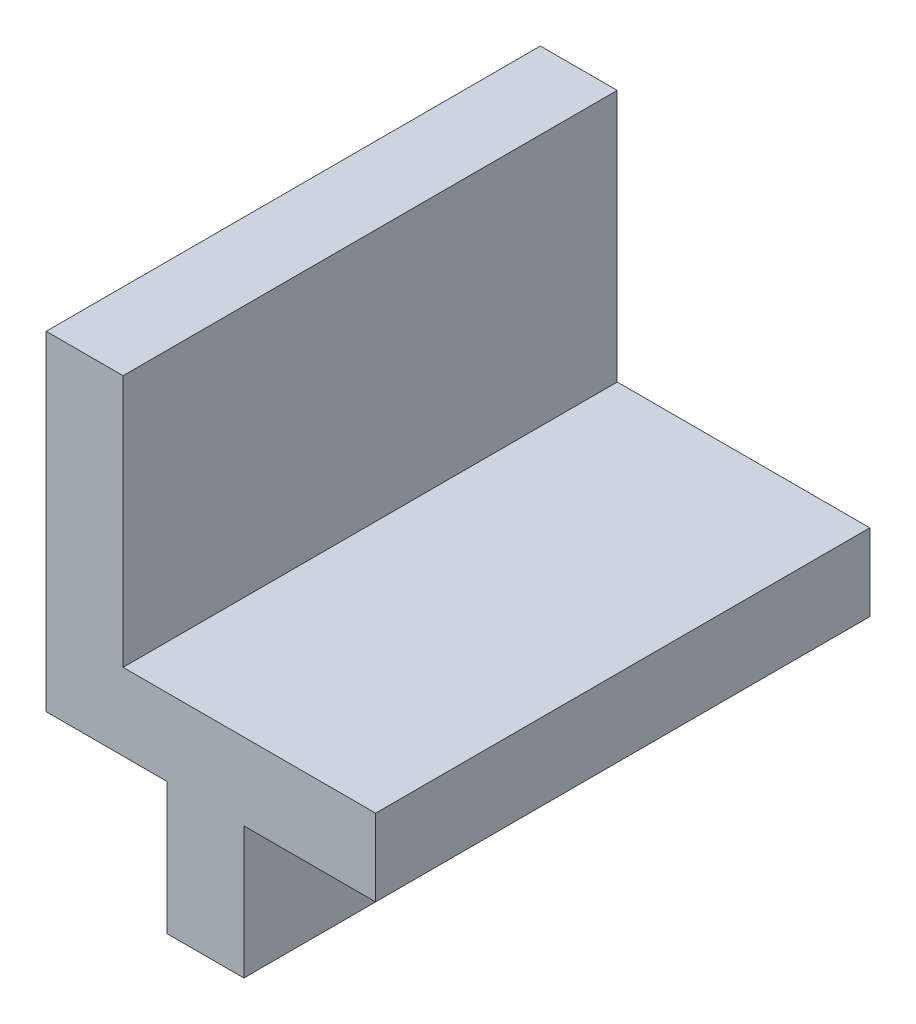
ISO-10303-21;
HEADER;
FILE_DESCRIPTION(('STEP AP214'),'2;1');
FILE_NAME('part.step','',(''),(''),'','','');
FILE_SCHEMA(('AUTOMOTIVE_DESIGN { 1 0 10303 214 1 1 1 1 }'));
ENDSEC;
DATA;
#1=APPLICATION_CONTEXT('core data for automotive mechanical design processes');
#2=APPLICATION_PROTOCOL_DEFINITION('international standard','automotive_design',2000,#1);
#3=PRODUCT_CONTEXT('',#1,'mechanical');
#4=PRODUCT('Part','Part','',(#3));
#5=PRODUCT_RELATED_PRODUCT_CATEGORY('part','',(#4));
#6=PRODUCT_DEFINITION_FORMATION('','',#4);
#7=PRODUCT_DEFINITION_CONTEXT('part definition',#1,'design');
#8=PRODUCT_DEFINITION('design','',#6,#7);
#9=PRODUCT_DEFINITION_SHAPE('','',#8);
#10=(LENGTH_UNIT() NAMED_UNIT(*) SI_UNIT(.MILLI.,.METRE.));
#11=(NAMED_UNIT(*) PLANE_ANGLE_UNIT() SI_UNIT($,.RADIAN.));
#12=(NAMED_UNIT(*) SI_UNIT($,.STERADIAN.) SOLID_ANGLE_UNIT());
#13=UNCERTAINTY_MEASURE_WITH_UNIT(LENGTH_MEASURE(1.E-05),#10,'distance_accuracy_value','');
#14=(GEOMETRIC_REPRESENTATION_CONTEXT(3) GLOBAL_UNCERTAINTY_ASSIGNED_CONTEXT((#13)) GLOBAL_UNIT_ASSIGNED_CONTEXT((#10,
#11,#12)) REPRESENTATION_CONTEXT('',''));
#15=CARTESIAN_POINT('',(0.,0.,0.));
#16=DIRECTION('',(0.,0.,1.));
#17=DIRECTION('',(1.,0.,0.));
#18=AXIS2_PLACEMENT_3D('',#15,#16,#17);
#19=CARTESIAN_POINT('',(0.,0.,45.));
#20=DIRECTION('',(0.,-1.,0.));
#21=DIRECTION('',(1.,0.,0.));
#22=AXIS2_PLACEMENT_3D('',#19,#20,#21);
#23=PLANE('',#22);
#24=DIRECTION('',(-1.,0.,0.));
#25=VECTOR('',#24,1.);
#26=CARTESIAN_POINT('',(0.,0.,0.));
#27=LINE('',#26,#25);
#28=CARTESIAN_POINT('',(-19.,0.,0.));
#29=VERTEX_POINT('',#28);
#30=CARTESIAN_POINT('',(-30.,0.,0.));
#31=VERTEX_POINT('',#30);
#32=EDGE_CURVE('E59',#29,#31,#27,.T.);
#33=ORIENTED_EDGE('',*,*,#32,.F.);
#34=DIRECTION('',(0.,0.,1.));
#35=VECTOR('',#34,1.);
#36=CARTESIAN_POINT('',(-19.,0.,-13.8924439894498));
#37=LINE('',#36,#35);
#38=CARTESIAN_POINT('',(-19.,0.,45.));
#39=VERTEX_POINT('',#38);
#40=EDGE_CURVE('E54',#29,#39,#37,.T.);
#41=ORIENTED_EDGE('',*,*,#40,.T.);
#42=DIRECTION('',(-1.,0.,0.));
#43=VECTOR('',#42,1.);
#44=CARTESIAN_POINT('',(0.,0.,45.));
#45=LINE('',#44,#43);
#46=CARTESIAN_POINT('',(-30.,0.,45.));
#47=VERTEX_POINT('',#46);
#48=EDGE_CURVE('E137',#39,#47,#45,.T.);
#49=ORIENTED_EDGE('',*,*,#48,.T.);
#50=DIRECTION('',(0.,0.,-1.));
#51=VECTOR('',#50,1.);
#52=CARTESIAN_POINT('',(-30.,0.,45.));
#53=LINE('',#52,#51);
#54=EDGE_CURVE('E198',#47,#31,#53,.T.);
#55=ORIENTED_EDGE('',*,*,#54,.T.);
#56=EDGE_LOOP('',(#33,#41,#49,#55));
#57=FACE_BOUND('',#56,.T.);
#58=ADVANCED_FACE('F37',(#57),#23,.T.);
#59=CARTESIAN_POINT('',(0.,0.,45.));
#60=DIRECTION('',(1.,0.,0.));
#61=DIRECTION('',(0.,1.,0.));
#62=AXIS2_PLACEMENT_3D('',#59,#60,#61);
#63=PLANE('',#62);
#64=DIRECTION('',(0.,-1.,0.));
#65=VECTOR('',#64,1.);
#66=CARTESIAN_POINT('',(0.,0.,0.));
#67=LINE('',#66,#65);
#68=CARTESIAN_POINT('',(0.,7.,0.));
#69=VERTEX_POINT('',#68);
#70=CARTESIAN_POINT('',(0.,0.,0.));
#71=VERTEX_POINT('',#70);
#72=EDGE_CURVE('E162',#69,#71,#67,.T.);
#73=ORIENTED_EDGE('',*,*,#72,.F.);
#74=DIRECTION('',(0.,0.,-1.));
#75=VECTOR('',#74,1.);
#76=CARTESIAN_POINT('',(0.,7.,45.));
#77=LINE('',#76,#75);
#78=CARTESIAN_POINT('',(0.,7.,45.));
#79=VERTEX_POINT('',#78);
#80=EDGE_CURVE('E11',#79,#69,#77,.T.);
#81=ORIENTED_EDGE('',*,*,#80,.F.);
#82=DIRECTION('',(0.,-1.,0.));
#83=VECTOR('',#82,1.);
#84=CARTESIAN_POINT('',(0.,0.,45.));
#85=LINE('',#84,#83);
#86=CARTESIAN_POINT('',(0.,0.,45.));
#87=VERTEX_POINT('',#86);
#88=EDGE_CURVE('E168',#79,#87,#85,.T.);
#89=ORIENTED_EDGE('',*,*,#88,.T.);
#90=DIRECTION('',(0.,0.,-1.));
#91=VECTOR('',#90,1.);
#92=CARTESIAN_POINT('',(0.,0.,45.));
#93=LINE('',#92,#91);
#94=EDGE_CURVE('E188',#87,#71,#93,.T.);
#95=ORIENTED_EDGE('',*,*,#94,.T.);
#96=EDGE_LOOP('',(#73,#81,#89,#95));
#97=FACE_BOUND('',#96,.T.);
#98=ADVANCED_FACE('F39',(#97),#63,.T.);
#99=CARTESIAN_POINT('',(0.,7.,45.));
#100=DIRECTION('',(0.,1.,0.));
#101=DIRECTION('',(-1.,0.,0.));
#102=AXIS2_PLACEMENT_3D('',#99,#100,#101);
#103=PLANE('',#102);
#104=DIRECTION('',(1.,0.,0.));
#105=VECTOR('',#104,1.);
#106=CARTESIAN_POINT('',(0.,7.,0.));
#107=LINE('',#106,#105);
#108=CARTESIAN_POINT('',(-23.,7.,0.));
#109=VERTEX_POINT('',#108);
#110=EDGE_CURVE('E165',#109,#69,#107,.T.);
#111=ORIENTED_EDGE('',*,*,#110,.F.);
#112=DIRECTION('',(0.,0.,-1.));
#113=VECTOR('',#112,1.);
#114=CARTESIAN_POINT('',(-23.,7.,45.));
#115=LINE('',#114,#113);
#116=CARTESIAN_POINT('',(-23.,7.,45.));
#117=VERTEX_POINT('',#116);
#118=EDGE_CURVE('E46',#117,#109,#115,.T.);
#119=ORIENTED_EDGE('',*,*,#118,.F.);
#120=DIRECTION('',(1.,0.,0.));
#121=VECTOR('',#120,1.);
#122=CARTESIAN_POINT('',(0.,7.,45.));
#123=LINE('',#122,#121);
#124=EDGE_CURVE('E171',#117,#79,#123,.T.);
#125=ORIENTED_EDGE('',*,*,#124,.T.);
#126=ORIENTED_EDGE('',*,*,#80,.T.);
#127=EDGE_LOOP('',(#111,#119,#125,#126));
#128=FACE_BOUND('',#127,.T.);
#129=ADVANCED_FACE('F215',(#128),#103,.T.);
#130=CARTESIAN_POINT('',(-23.,0.,45.));
#131=DIRECTION('',(1.,0.,0.));
#132=DIRECTION('',(0.,1.,0.));
#133=AXIS2_PLACEMENT_3D('',#130,#131,#132);
#134=PLANE('',#133);
#135=DIRECTION('',(0.,-1.,0.));
#136=VECTOR('',#135,1.);
#137=CARTESIAN_POINT('',(-23.,0.,0.));
#138=LINE('',#137,#136);
#139=CARTESIAN_POINT('',(-23.,30.,0.));
#140=VERTEX_POINT('',#139);
#141=EDGE_CURVE('E209',#140,#109,#138,.T.);
#142=ORIENTED_EDGE('',*,*,#141,.F.);
#143=DIRECTION('',(0.,0.,-1.));
#144=VECTOR('',#143,1.);
#145=CARTESIAN_POINT('',(-23.,30.,45.));
#146=LINE('',#145,#144);
#147=CARTESIAN_POINT('',(-23.,30.,45.));
#148=VERTEX_POINT('',#147);
#149=EDGE_CURVE('E202',#148,#140,#146,.T.);
#150=ORIENTED_EDGE('',*,*,#149,.F.);
#151=DIRECTION('',(0.,-1.,0.));
#152=VECTOR('',#151,1.);
#153=CARTESIAN_POINT('',(-23.,0.,45.));
#154=LINE('',#153,#152);
#155=EDGE_CURVE('E175',#148,#117,#154,.T.);
#156=ORIENTED_EDGE('',*,*,#155,.T.);
#157=ORIENTED_EDGE('',*,*,#118,.T.);
#158=EDGE_LOOP('',(#142,#150,#156,#157));
#159=FACE_BOUND('',#158,.T.);
#160=ADVANCED_FACE('F207',(#159),#134,.T.);
#161=CARTESIAN_POINT('',(0.,30.,45.));
#162=DIRECTION('',(0.,1.,0.));
#163=DIRECTION('',(0.,0.,1.));
#164=AXIS2_PLACEMENT_3D('',#161,#162,#163);
#165=PLANE('',#164);
#166=DIRECTION('',(1.,0.,0.));
#167=VECTOR('',#166,1.);
#168=CARTESIAN_POINT('',(0.,30.,0.));
#169=LINE('',#168,#167);
#170=CARTESIAN_POINT('',(-30.,30.,0.));
#171=VERTEX_POINT('',#170);
#172=EDGE_CURVE('E220',#171,#140,#169,.T.);
#173=ORIENTED_EDGE('',*,*,#172,.F.);
#174=DIRECTION('',(0.,0.,-1.));
#175=VECTOR('',#174,1.);
#176=CARTESIAN_POINT('',(-30.,30.,45.));
#177=LINE('',#176,#175);
#178=CARTESIAN_POINT('',(-30.,30.,45.));
#179=VERTEX_POINT('',#178);
#180=EDGE_CURVE('E200',#179,#171,#177,.T.);
#181=ORIENTED_EDGE('',*,*,#180,.F.);
#182=DIRECTION('',(1.,0.,0.));
#183=VECTOR('',#182,1.);
#184=CARTESIAN_POINT('',(0.,30.,45.));
#185=LINE('',#184,#183);
#186=EDGE_CURVE('E178',#179,#148,#185,.T.);
#187=ORIENTED_EDGE('',*,*,#186,.T.);
#188=ORIENTED_EDGE('',*,*,#149,.T.);
#189=EDGE_LOOP('',(#173,#181,#187,#188));
#190=FACE_BOUND('',#189,.T.);
#191=ADVANCED_FACE('F228',(#190),#165,.T.);
#192=CARTESIAN_POINT('',(-30.,0.,45.));
#193=DIRECTION('',(-1.,0.,0.));
#194=DIRECTION('',(0.,0.,1.));
#195=AXIS2_PLACEMENT_3D('',#192,#193,#194);
#196=PLANE('',#195);
#197=DIRECTION('',(0.,1.,0.));
#198=VECTOR('',#197,1.);
#199=CARTESIAN_POINT('',(-30.,0.,0.));
#200=LINE('',#199,#198);
#201=EDGE_CURVE('E191',#31,#171,#200,.T.);
#202=ORIENTED_EDGE('',*,*,#201,.F.);
#203=ORIENTED_EDGE('',*,*,#54,.F.);
#204=DIRECTION('',(0.,1.,0.));
#205=VECTOR('',#204,1.);
#206=CARTESIAN_POINT('',(-30.,0.,45.));
#207=LINE('',#206,#205);
#208=EDGE_CURVE('E181',#47,#179,#207,.T.);
#209=ORIENTED_EDGE('',*,*,#208,.T.);
#210=ORIENTED_EDGE('',*,*,#180,.T.);
#211=EDGE_LOOP('',(#202,#203,#209,#210));
#212=FACE_BOUND('',#211,.T.);
#213=ADVANCED_FACE('F225',(#212),#196,.T.);
#214=DIRECTION('',(0.,0.,1.));
#215=VECTOR('',#214,1.);
#216=CARTESIAN_POINT('',(-12.,0.,-13.8924439894498));
#217=LINE('',#216,#215);
#218=CARTESIAN_POINT('',(-12.,0.,0.));
#219=VERTEX_POINT('',#218);
#220=CARTESIAN_POINT('',(-12.,0.,45.));
#221=VERTEX_POINT('',#220);
#222=EDGE_CURVE('E142',#219,#221,#217,.T.);
#223=ORIENTED_EDGE('',*,*,#222,.F.);
#224=EDGE_CURVE('E172',#71,#219,#27,.T.);
#225=ORIENTED_EDGE('',*,*,#224,.F.);
#226=ORIENTED_EDGE('',*,*,#94,.F.);
#227=EDGE_CURVE('E186',#87,#221,#45,.T.);
#228=ORIENTED_EDGE('',*,*,#227,.T.);
#229=EDGE_LOOP('',(#223,#225,#226,#228));
#230=FACE_BOUND('',#229,.T.);
#231=ADVANCED_FACE('F235',(#230),#23,.T.);
#232=CARTESIAN_POINT('',(0.,0.,45.));
#233=DIRECTION('',(0.,0.,1.));
#234=DIRECTION('',(1.,0.,0.));
#235=AXIS2_PLACEMENT_3D('',#232,#233,#234);
#236=PLANE('',#235);
#237=ORIENTED_EDGE('',*,*,#88,.F.);
#238=ORIENTED_EDGE('',*,*,#124,.F.);
#239=ORIENTED_EDGE('',*,*,#155,.F.);
#240=ORIENTED_EDGE('',*,*,#186,.F.);
#241=ORIENTED_EDGE('',*,*,#208,.F.);
#242=ORIENTED_EDGE('',*,*,#48,.F.);
#243=DIRECTION('',(0.,-1.,0.));
#244=VECTOR('',#243,1.);
#245=CARTESIAN_POINT('',(-19.,0.,45.));
#246=LINE('',#245,#244);
#247=CARTESIAN_POINT('',(-19.,-12.,45.));
#248=VERTEX_POINT('',#247);
#249=EDGE_CURVE('E119',#39,#248,#246,.T.);
#250=ORIENTED_EDGE('',*,*,#249,.T.);
#251=DIRECTION('',(1.,0.,0.));
#252=VECTOR('',#251,1.);
#253=CARTESIAN_POINT('',(-19.,-12.,45.));
#254=LINE('',#253,#252);
#255=CARTESIAN_POINT('',(-12.,-12.,45.));
#256=VERTEX_POINT('',#255);
#257=EDGE_CURVE('E127',#248,#256,#254,.T.);
#258=ORIENTED_EDGE('',*,*,#257,.T.);
#259=DIRECTION('',(0.,1.,0.));
#260=VECTOR('',#259,1.);
#261=CARTESIAN_POINT('',(-12.,0.,45.));
#262=LINE('',#261,#260);
#263=EDGE_CURVE('E124',#256,#221,#262,.T.);
#264=ORIENTED_EDGE('',*,*,#263,.T.);
#265=ORIENTED_EDGE('',*,*,#227,.F.);
#266=EDGE_LOOP('',(#237,#238,#239,#240,#241,#242,#250,#258,#264,#265));
#267=FACE_BOUND('',#266,.T.);
#268=ADVANCED_FACE('F135',(#267),#236,.T.);
#269=CARTESIAN_POINT('',(0.,0.,0.));
#270=DIRECTION('',(0.,0.,1.));
#271=DIRECTION('',(1.,0.,0.));
#272=AXIS2_PLACEMENT_3D('',#269,#270,#271);
#273=PLANE('',#272);
#274=ORIENTED_EDGE('',*,*,#72,.T.);
#275=ORIENTED_EDGE('',*,*,#224,.T.);
#276=DIRECTION('',(0.,-1.,0.));
#277=VECTOR('',#276,1.);
#278=CARTESIAN_POINT('',(-12.,0.,0.));
#279=LINE('',#278,#277);
#280=CARTESIAN_POINT('',(-12.,-12.,0.));
#281=VERTEX_POINT('',#280);
#282=EDGE_CURVE('E141',#219,#281,#279,.T.);
#283=ORIENTED_EDGE('',*,*,#282,.T.);
#284=DIRECTION('',(-1.,0.,0.));
#285=VECTOR('',#284,1.);
#286=CARTESIAN_POINT('',(-19.,-12.,0.));
#287=LINE('',#286,#285);
#288=CARTESIAN_POINT('',(-19.,-12.,0.));
#289=VERTEX_POINT('',#288);
#290=EDGE_CURVE('E160',#281,#289,#287,.T.);
#291=ORIENTED_EDGE('',*,*,#290,.T.);
#292=DIRECTION('',(0.,1.,0.));
#293=VECTOR('',#292,1.);
#294=CARTESIAN_POINT('',(-19.,0.,0.));
#295=LINE('',#294,#293);
#296=EDGE_CURVE('E120',#289,#29,#295,.T.);
#297=ORIENTED_EDGE('',*,*,#296,.T.);
#298=ORIENTED_EDGE('',*,*,#32,.T.);
#299=ORIENTED_EDGE('',*,*,#201,.T.);
#300=ORIENTED_EDGE('',*,*,#172,.T.);
#301=ORIENTED_EDGE('',*,*,#141,.T.);
#302=ORIENTED_EDGE('',*,*,#110,.T.);
#303=EDGE_LOOP('',(#274,#275,#283,#291,#297,#298,#299,#300,#301,#302));
#304=FACE_BOUND('',#303,.T.);
#305=ADVANCED_FACE('F217',(#304),#273,.F.);
#306=CARTESIAN_POINT('',(-19.,0.,-13.8924439894498));
#307=DIRECTION('',(-1.,0.,0.));
#308=DIRECTION('',(0.,-1.,0.));
#309=AXIS2_PLACEMENT_3D('',#306,#307,#308);
#310=PLANE('',#309);
#311=ORIENTED_EDGE('',*,*,#296,.F.);
#312=DIRECTION('',(0.,0.,1.));
#313=VECTOR('',#312,1.);
#314=CARTESIAN_POINT('',(-19.,-12.,-13.8924439894498));
#315=LINE('',#314,#313);
#316=EDGE_CURVE('E115',#289,#248,#315,.T.);
#317=ORIENTED_EDGE('',*,*,#316,.T.);
#318=ORIENTED_EDGE('',*,*,#249,.F.);
#319=ORIENTED_EDGE('',*,*,#40,.F.);
#320=EDGE_LOOP('',(#311,#317,#318,#319));
#321=FACE_BOUND('',#320,.T.);
#322=ADVANCED_FACE('F117',(#321),#310,.T.);
#323=CARTESIAN_POINT('',(-12.,0.,-13.8924439894498));
#324=DIRECTION('',(1.,0.,0.));
#325=DIRECTION('',(0.,0.,-1.));
#326=AXIS2_PLACEMENT_3D('',#323,#324,#325);
#327=PLANE('',#326);
#328=ORIENTED_EDGE('',*,*,#282,.F.);
#329=ORIENTED_EDGE('',*,*,#222,.T.);
#330=ORIENTED_EDGE('',*,*,#263,.F.);
#331=DIRECTION('',(0.,0.,1.));
#332=VECTOR('',#331,1.);
#333=CARTESIAN_POINT('',(-12.,-12.,-13.8924439894498));
#334=LINE('',#333,#332);
#335=EDGE_CURVE('E123',#281,#256,#334,.T.);
#336=ORIENTED_EDGE('',*,*,#335,.F.);
#337=EDGE_LOOP('',(#328,#329,#330,#336));
#338=FACE_BOUND('',#337,.T.);
#339=ADVANCED_FACE('F237',(#338),#327,.T.);
#340=CARTESIAN_POINT('',(-19.,-12.,-13.8924439894498));
#341=DIRECTION('',(0.,-1.,0.));
#342=DIRECTION('',(0.,0.,-1.));
#343=AXIS2_PLACEMENT_3D('',#340,#341,#342);
#344=PLANE('',#343);
#345=ORIENTED_EDGE('',*,*,#290,.F.);
#346=ORIENTED_EDGE('',*,*,#335,.T.);
#347=ORIENTED_EDGE('',*,*,#257,.F.);
#348=ORIENTED_EDGE('',*,*,#316,.F.);
#349=EDGE_LOOP('',(#345,#346,#347,#348));
#350=FACE_BOUND('',#349,.T.);
#351=ADVANCED_FACE('F128',(#350),#344,.T.);
#352=CLOSED_SHELL('',(#58,#98,#129,#160,#191,#213,#231,#268,#305,#322,#339,#351));
#353=MANIFOLD_SOLID_BREP('B2',#352);
#354=ADVANCED_BREP_SHAPE_REPRESENTATION('',(#18,#353),#14);
#355=SHAPE_DEFINITION_REPRESENTATION(#9,#354);
ENDSEC;
END-ISO-10303-21;
